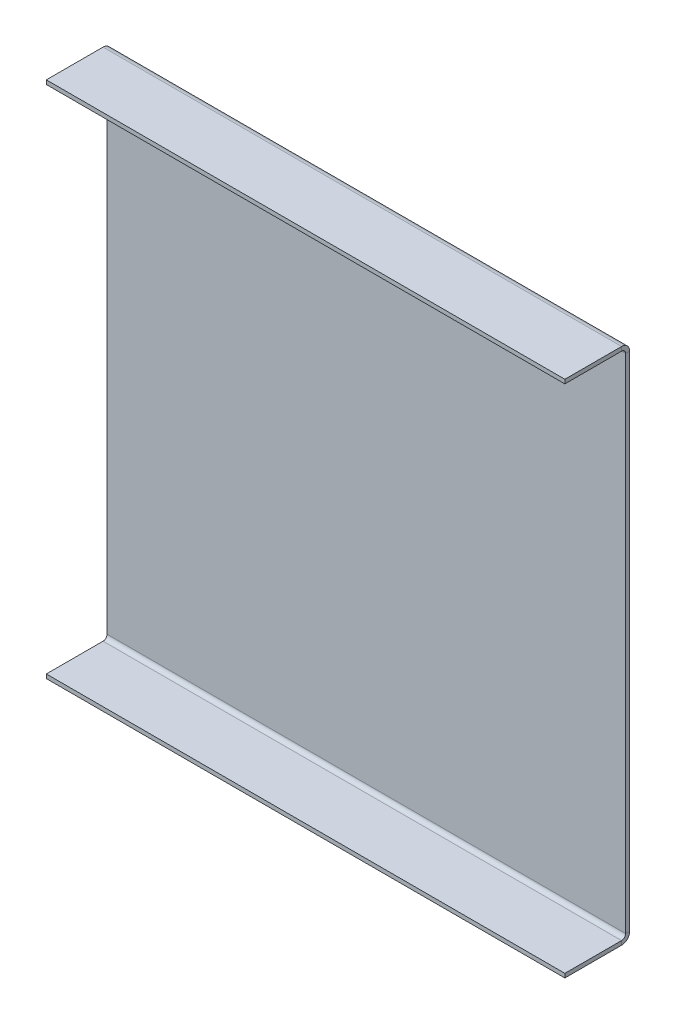
ISO-10303-21;
HEADER;
FILE_DESCRIPTION(('STEP AP214'),'2;1');
FILE_NAME('part.step','',(''),(''),'','','');
FILE_SCHEMA(('AUTOMOTIVE_DESIGN { 1 0 10303 214 1 1 1 1 }'));
ENDSEC;
DATA;
#1=APPLICATION_CONTEXT('core data for automotive mechanical design processes');
#2=APPLICATION_PROTOCOL_DEFINITION('international standard','automotive_design',2000,#1);
#3=PRODUCT_CONTEXT('',#1,'mechanical');
#4=PRODUCT('Part','Part','',(#3));
#5=PRODUCT_RELATED_PRODUCT_CATEGORY('part','',(#4));
#6=PRODUCT_DEFINITION_FORMATION('','',#4);
#7=PRODUCT_DEFINITION_CONTEXT('part definition',#1,'design');
#8=PRODUCT_DEFINITION('design','',#6,#7);
#9=PRODUCT_DEFINITION_SHAPE('','',#8);
#10=(LENGTH_UNIT() NAMED_UNIT(*) SI_UNIT(.MILLI.,.METRE.));
#11=(NAMED_UNIT(*) PLANE_ANGLE_UNIT() SI_UNIT($,.RADIAN.));
#12=(NAMED_UNIT(*) SI_UNIT($,.STERADIAN.) SOLID_ANGLE_UNIT());
#13=UNCERTAINTY_MEASURE_WITH_UNIT(LENGTH_MEASURE(1.E-05),#10,'distance_accuracy_value','');
#14=(GEOMETRIC_REPRESENTATION_CONTEXT(3) GLOBAL_UNCERTAINTY_ASSIGNED_CONTEXT((#13)) GLOBAL_UNIT_ASSIGNED_CONTEXT((#10,
#11,#12)) REPRESENTATION_CONTEXT('',''));
#15=CARTESIAN_POINT('',(0.,0.,0.));
#16=DIRECTION('',(0.,0.,1.));
#17=DIRECTION('',(1.,0.,0.));
#18=AXIS2_PLACEMENT_3D('',#15,#16,#17);
#19=CARTESIAN_POINT('',(0.,0.,0.));
#20=DIRECTION('',(0.,0.,1.));
#21=DIRECTION('',(1.,0.,0.));
#22=AXIS2_PLACEMENT_3D('',#19,#20,#21);
#23=PLANE('',#22);
#24=DIRECTION('',(1.,0.,0.));
#25=VECTOR('',#24,1.);
#26=CARTESIAN_POINT('',(203.2,3.17499999999999,0.));
#27=LINE('',#26,#25);
#28=CARTESIAN_POINT('',(203.2,3.17499999999999,0.));
#29=VERTEX_POINT('',#28);
#30=CARTESIAN_POINT('',(0.,3.17500000000001,0.));
#31=VERTEX_POINT('',#30);
#32=EDGE_CURVE('E215',#29,#31,#27,.F.);
#33=ORIENTED_EDGE('',*,*,#32,.T.);
#34=DIRECTION('',(0.,1.,0.));
#35=VECTOR('',#34,1.);
#36=CARTESIAN_POINT('',(0.,0.,0.));
#37=LINE('',#36,#35);
#38=CARTESIAN_POINT('',(0.,200.025,0.));
#39=VERTEX_POINT('',#38);
#40=EDGE_CURVE('E94',#31,#39,#37,.T.);
#41=ORIENTED_EDGE('',*,*,#40,.T.);
#42=DIRECTION('',(-1.,0.,0.));
#43=VECTOR('',#42,1.);
#44=CARTESIAN_POINT('',(0.,200.025,0.));
#45=LINE('',#44,#43);
#46=CARTESIAN_POINT('',(203.2,200.025,0.));
#47=VERTEX_POINT('',#46);
#48=EDGE_CURVE('E268',#39,#47,#45,.F.);
#49=ORIENTED_EDGE('',*,*,#48,.T.);
#50=DIRECTION('',(0.,1.,0.));
#51=VECTOR('',#50,1.);
#52=CARTESIAN_POINT('',(203.2,0.,0.));
#53=LINE('',#52,#51);
#54=EDGE_CURVE('E13',#29,#47,#53,.T.);
#55=ORIENTED_EDGE('',*,*,#54,.F.);
#56=EDGE_LOOP('',(#33,#41,#49,#55));
#57=FACE_BOUND('',#56,.T.);
#58=ADVANCED_FACE('F85',(#57),#23,.F.);
#59=CARTESIAN_POINT('',(0.,0.,1.5875));
#60=DIRECTION('',(0.,0.,1.));
#61=DIRECTION('',(1.,0.,0.));
#62=AXIS2_PLACEMENT_3D('',#59,#60,#61);
#63=PLANE('',#62);
#64=DIRECTION('',(0.,1.,0.));
#65=VECTOR('',#64,1.);
#66=CARTESIAN_POINT('',(0.,0.,1.5875));
#67=LINE('',#66,#65);
#68=CARTESIAN_POINT('',(0.,3.17499999999999,1.5875));
#69=VERTEX_POINT('',#68);
#70=CARTESIAN_POINT('',(0.,200.025,1.5875));
#71=VERTEX_POINT('',#70);
#72=EDGE_CURVE('E89',#69,#71,#67,.T.);
#73=ORIENTED_EDGE('',*,*,#72,.F.);
#74=DIRECTION('',(1.,0.,0.));
#75=VECTOR('',#74,1.);
#76=CARTESIAN_POINT('',(203.2,3.17499999999999,1.5875));
#77=LINE('',#76,#75);
#78=CARTESIAN_POINT('',(203.2,3.17499999999999,1.5875));
#79=VERTEX_POINT('',#78);
#80=EDGE_CURVE('E227',#79,#69,#77,.F.);
#81=ORIENTED_EDGE('',*,*,#80,.F.);
#82=DIRECTION('',(0.,1.,0.));
#83=VECTOR('',#82,1.);
#84=CARTESIAN_POINT('',(203.2,0.,1.5875));
#85=LINE('',#84,#83);
#86=CARTESIAN_POINT('',(203.2,200.025,1.5875));
#87=VERTEX_POINT('',#86);
#88=EDGE_CURVE('E290',#79,#87,#85,.T.);
#89=ORIENTED_EDGE('',*,*,#88,.T.);
#90=DIRECTION('',(-1.,0.,0.));
#91=VECTOR('',#90,1.);
#92=CARTESIAN_POINT('',(0.,200.025,1.5875));
#93=LINE('',#92,#91);
#94=EDGE_CURVE('E280',#71,#87,#93,.F.);
#95=ORIENTED_EDGE('',*,*,#94,.F.);
#96=EDGE_LOOP('',(#73,#81,#89,#95));
#97=FACE_BOUND('',#96,.T.);
#98=ADVANCED_FACE('F293',(#97),#63,.T.);
#99=CARTESIAN_POINT('',(203.2,0.,0.));
#100=DIRECTION('',(1.,0.,0.));
#101=DIRECTION('',(0.,1.,0.));
#102=AXIS2_PLACEMENT_3D('',#99,#100,#101);
#103=PLANE('',#102);
#104=ORIENTED_EDGE('',*,*,#88,.F.);
#105=DIRECTION('',(0.,0.,-1.));
#106=VECTOR('',#105,1.);
#107=CARTESIAN_POINT('',(203.2,3.17499999999999,1.5875));
#108=LINE('',#107,#106);
#109=EDGE_CURVE('E221',#79,#29,#108,.T.);
#110=ORIENTED_EDGE('',*,*,#109,.T.);
#111=ORIENTED_EDGE('',*,*,#54,.T.);
#112=DIRECTION('',(0.,0.,-1.));
#113=VECTOR('',#112,1.);
#114=CARTESIAN_POINT('',(203.2,200.025,1.5875));
#115=LINE('',#114,#113);
#116=EDGE_CURVE('E285',#87,#47,#115,.T.);
#117=ORIENTED_EDGE('',*,*,#116,.F.);
#118=EDGE_LOOP('',(#104,#110,#111,#117));
#119=FACE_BOUND('',#118,.T.);
#120=ADVANCED_FACE('F296',(#119),#103,.T.);
#121=CARTESIAN_POINT('',(0.,0.,0.));
#122=DIRECTION('',(1.,0.,0.));
#123=DIRECTION('',(0.,1.,0.));
#124=AXIS2_PLACEMENT_3D('',#121,#122,#123);
#125=PLANE('',#124);
#126=DIRECTION('',(0.,0.,-1.));
#127=VECTOR('',#126,1.);
#128=CARTESIAN_POINT('',(0.,3.17499999999999,1.5875));
#129=LINE('',#128,#127);
#130=EDGE_CURVE('E233',#69,#31,#129,.T.);
#131=ORIENTED_EDGE('',*,*,#130,.F.);
#132=ORIENTED_EDGE('',*,*,#72,.T.);
#133=DIRECTION('',(0.,0.,-1.));
#134=VECTOR('',#133,1.);
#135=CARTESIAN_POINT('',(0.,200.025,1.5875));
#136=LINE('',#135,#134);
#137=EDGE_CURVE('E274',#71,#39,#136,.T.);
#138=ORIENTED_EDGE('',*,*,#137,.T.);
#139=ORIENTED_EDGE('',*,*,#40,.F.);
#140=EDGE_LOOP('',(#131,#132,#138,#139));
#141=FACE_BOUND('',#140,.T.);
#142=ADVANCED_FACE('F87',(#141),#125,.F.);
#143=CARTESIAN_POINT('',(203.2,200.025,3.17499999999999));
#144=DIRECTION('',(1.,0.,0.));
#145=DIRECTION('',(0.,0.,-1.));
#146=AXIS2_PLACEMENT_3D('',#143,#144,#145);
#147=PLANE('',#146);
#148=DIRECTION('',(0.,-1.,0.));
#149=VECTOR('',#148,1.);
#150=CARTESIAN_POINT('',(203.2,203.2,3.17499999999998));
#151=LINE('',#150,#149);
#152=CARTESIAN_POINT('',(203.2,201.6125,3.17499999999998));
#153=VERTEX_POINT('',#152);
#154=CARTESIAN_POINT('',(203.2,203.2,3.17499999999998));
#155=VERTEX_POINT('',#154);
#156=EDGE_CURVE('E236',#153,#155,#151,.F.);
#157=ORIENTED_EDGE('',*,*,#156,.F.);
#158=CARTESIAN_POINT('',(203.2,200.025,3.17499999999999));
#159=DIRECTION('',(-1.,0.,0.));
#160=DIRECTION('',(0.,0.,1.));
#161=AXIS2_PLACEMENT_3D('',#158,#159,#160);
#162=CIRCLE('',#161,1.58749999999999);
#163=EDGE_CURVE('E277',#87,#153,#162,.F.);
#164=ORIENTED_EDGE('',*,*,#163,.F.);
#165=ORIENTED_EDGE('',*,*,#116,.T.);
#166=CARTESIAN_POINT('',(203.2,200.025,3.17499999999999));
#167=DIRECTION('',(-1.,0.,0.));
#168=DIRECTION('',(0.,0.,1.));
#169=AXIS2_PLACEMENT_3D('',#166,#167,#168);
#170=CIRCLE('',#169,3.17499999999999);
#171=EDGE_CURVE('E270',#47,#155,#170,.F.);
#172=ORIENTED_EDGE('',*,*,#171,.T.);
#173=EDGE_LOOP('',(#157,#164,#165,#172));
#174=FACE_BOUND('',#173,.T.);
#175=ADVANCED_FACE('F304',(#174),#147,.T.);
#176=CARTESIAN_POINT('',(0.,200.025,3.17499999999999));
#177=DIRECTION('',(1.,0.,0.));
#178=DIRECTION('',(0.,0.,-1.));
#179=AXIS2_PLACEMENT_3D('',#176,#177,#178);
#180=PLANE('',#179);
#181=CARTESIAN_POINT('',(0.,200.025,3.17499999999999));
#182=DIRECTION('',(-1.,0.,0.));
#183=DIRECTION('',(0.,0.,1.));
#184=AXIS2_PLACEMENT_3D('',#181,#182,#183);
#185=CIRCLE('',#184,1.58749999999999);
#186=CARTESIAN_POINT('',(0.,201.6125,3.17499999999998));
#187=VERTEX_POINT('',#186);
#188=EDGE_CURVE('E241',#187,#71,#185,.T.);
#189=ORIENTED_EDGE('',*,*,#188,.F.);
#190=DIRECTION('',(0.,-1.,0.));
#191=VECTOR('',#190,1.);
#192=CARTESIAN_POINT('',(0.,201.6125,3.17499999999998));
#193=LINE('',#192,#191);
#194=CARTESIAN_POINT('',(0.,203.2,3.17499999999998));
#195=VERTEX_POINT('',#194);
#196=EDGE_CURVE('E261',#187,#195,#193,.F.);
#197=ORIENTED_EDGE('',*,*,#196,.T.);
#198=CARTESIAN_POINT('',(0.,200.025,3.17499999999999));
#199=DIRECTION('',(-1.,0.,0.));
#200=DIRECTION('',(0.,0.,1.));
#201=AXIS2_PLACEMENT_3D('',#198,#199,#200);
#202=CIRCLE('',#201,3.17499999999999);
#203=EDGE_CURVE('E271',#195,#39,#202,.T.);
#204=ORIENTED_EDGE('',*,*,#203,.T.);
#205=ORIENTED_EDGE('',*,*,#137,.F.);
#206=EDGE_LOOP('',(#189,#197,#204,#205));
#207=FACE_BOUND('',#206,.T.);
#208=ADVANCED_FACE('F324',(#207),#180,.F.);
#209=CARTESIAN_POINT('',(0.,200.025,3.17499999999999));
#210=DIRECTION('',(-1.,0.,0.));
#211=DIRECTION('',(0.,1.,0.));
#212=AXIS2_PLACEMENT_3D('',#209,#210,#211);
#213=CYLINDRICAL_SURFACE('',#212,3.17499999999999);
#214=ORIENTED_EDGE('',*,*,#48,.F.);
#215=ORIENTED_EDGE('',*,*,#203,.F.);
#216=DIRECTION('',(-1.,0.,0.));
#217=VECTOR('',#216,1.);
#218=CARTESIAN_POINT('',(203.2,203.2,3.17499999999998));
#219=LINE('',#218,#217);
#220=EDGE_CURVE('E259',#195,#155,#219,.F.);
#221=ORIENTED_EDGE('',*,*,#220,.T.);
#222=ORIENTED_EDGE('',*,*,#171,.F.);
#223=EDGE_LOOP('',(#214,#215,#221,#222));
#224=FACE_BOUND('',#223,.T.);
#225=ADVANCED_FACE('F334',(#224),#213,.T.);
#226=CARTESIAN_POINT('',(0.,200.025,3.17499999999999));
#227=DIRECTION('',(-1.,0.,0.));
#228=DIRECTION('',(0.,1.,0.));
#229=AXIS2_PLACEMENT_3D('',#226,#227,#228);
#230=CYLINDRICAL_SURFACE('',#229,1.58749999999999);
#231=ORIENTED_EDGE('',*,*,#94,.T.);
#232=ORIENTED_EDGE('',*,*,#163,.T.);
#233=DIRECTION('',(-1.,0.,0.));
#234=VECTOR('',#233,1.);
#235=CARTESIAN_POINT('',(203.2,201.6125,3.17499999999998));
#236=LINE('',#235,#234);
#237=EDGE_CURVE('E264',#153,#187,#236,.T.);
#238=ORIENTED_EDGE('',*,*,#237,.T.);
#239=ORIENTED_EDGE('',*,*,#188,.T.);
#240=EDGE_LOOP('',(#231,#232,#238,#239));
#241=FACE_BOUND('',#240,.T.);
#242=ADVANCED_FACE('F301',(#241),#230,.F.);
#243=CARTESIAN_POINT('',(0.,203.2,25.4));
#244=DIRECTION('',(1.,0.,0.));
#245=DIRECTION('',(0.,0.,-1.));
#246=AXIS2_PLACEMENT_3D('',#243,#244,#245);
#247=PLANE('',#246);
#248=ORIENTED_EDGE('',*,*,#196,.F.);
#249=DIRECTION('',(0.,0.,-1.));
#250=VECTOR('',#249,1.);
#251=CARTESIAN_POINT('',(0.,201.6125,25.4));
#252=LINE('',#251,#250);
#253=CARTESIAN_POINT('',(0.,201.6125,25.4));
#254=VERTEX_POINT('',#253);
#255=EDGE_CURVE('E257',#187,#254,#252,.F.);
#256=ORIENTED_EDGE('',*,*,#255,.T.);
#257=DIRECTION('',(0.,-1.,0.));
#258=VECTOR('',#257,1.);
#259=CARTESIAN_POINT('',(0.,203.2,25.4));
#260=LINE('',#259,#258);
#261=CARTESIAN_POINT('',(0.,203.2,25.4));
#262=VERTEX_POINT('',#261);
#263=EDGE_CURVE('E238',#262,#254,#260,.T.);
#264=ORIENTED_EDGE('',*,*,#263,.F.);
#265=DIRECTION('',(0.,0.,1.));
#266=VECTOR('',#265,1.);
#267=CARTESIAN_POINT('',(0.,203.2,-7.16085462385513E-13));
#268=LINE('',#267,#266);
#269=EDGE_CURVE('E250',#195,#262,#268,.T.);
#270=ORIENTED_EDGE('',*,*,#269,.F.);
#271=EDGE_LOOP('',(#248,#256,#264,#270));
#272=FACE_BOUND('',#271,.T.);
#273=ADVANCED_FACE('F326',(#272),#247,.F.);
#274=CARTESIAN_POINT('',(203.2,203.2,1.58749999999999));
#275=DIRECTION('',(-1.,0.,0.));
#276=DIRECTION('',(0.,0.,1.));
#277=AXIS2_PLACEMENT_3D('',#274,#275,#276);
#278=PLANE('',#277);
#279=ORIENTED_EDGE('',*,*,#156,.T.);
#280=DIRECTION('',(0.,0.,-1.));
#281=VECTOR('',#280,1.);
#282=CARTESIAN_POINT('',(203.2,203.2,-7.16085462385513E-13));
#283=LINE('',#282,#281);
#284=CARTESIAN_POINT('',(203.2,203.2,25.4));
#285=VERTEX_POINT('',#284);
#286=EDGE_CURVE('E245',#285,#155,#283,.T.);
#287=ORIENTED_EDGE('',*,*,#286,.F.);
#288=DIRECTION('',(0.,-1.,0.));
#289=VECTOR('',#288,1.);
#290=CARTESIAN_POINT('',(203.2,203.2,25.4));
#291=LINE('',#290,#289);
#292=CARTESIAN_POINT('',(203.2,201.6125,25.4));
#293=VERTEX_POINT('',#292);
#294=EDGE_CURVE('E242',#285,#293,#291,.T.);
#295=ORIENTED_EDGE('',*,*,#294,.T.);
#296=DIRECTION('',(0.,0.,1.));
#297=VECTOR('',#296,1.);
#298=CARTESIAN_POINT('',(203.2,201.6125,1.5875));
#299=LINE('',#298,#297);
#300=EDGE_CURVE('E252',#293,#153,#299,.F.);
#301=ORIENTED_EDGE('',*,*,#300,.T.);
#302=EDGE_LOOP('',(#279,#287,#295,#301));
#303=FACE_BOUND('',#302,.T.);
#304=ADVANCED_FACE('F307',(#303),#278,.F.);
#305=CARTESIAN_POINT('',(0.,203.2,-7.16085462385513E-13));
#306=DIRECTION('',(0.,-1.,0.));
#307=DIRECTION('',(0.,0.,-1.));
#308=AXIS2_PLACEMENT_3D('',#305,#306,#307);
#309=PLANE('',#308);
#310=ORIENTED_EDGE('',*,*,#220,.F.);
#311=ORIENTED_EDGE('',*,*,#269,.T.);
#312=DIRECTION('',(1.,0.,0.));
#313=VECTOR('',#312,1.);
#314=CARTESIAN_POINT('',(0.,203.2,25.4));
#315=LINE('',#314,#313);
#316=EDGE_CURVE('E248',#262,#285,#315,.T.);
#317=ORIENTED_EDGE('',*,*,#316,.T.);
#318=ORIENTED_EDGE('',*,*,#286,.T.);
#319=EDGE_LOOP('',(#310,#311,#317,#318));
#320=FACE_BOUND('',#319,.T.);
#321=ADVANCED_FACE('F311',(#320),#309,.F.);
#322=CARTESIAN_POINT('',(0.,201.6125,-7.105427357601E-13));
#323=DIRECTION('',(0.,-1.,0.));
#324=DIRECTION('',(0.,0.,-1.));
#325=AXIS2_PLACEMENT_3D('',#322,#323,#324);
#326=PLANE('',#325);
#327=ORIENTED_EDGE('',*,*,#255,.F.);
#328=ORIENTED_EDGE('',*,*,#237,.F.);
#329=ORIENTED_EDGE('',*,*,#300,.F.);
#330=DIRECTION('',(-1.,0.,0.));
#331=VECTOR('',#330,1.);
#332=CARTESIAN_POINT('',(203.2,201.6125,25.4));
#333=LINE('',#332,#331);
#334=EDGE_CURVE('E255',#254,#293,#333,.F.);
#335=ORIENTED_EDGE('',*,*,#334,.F.);
#336=EDGE_LOOP('',(#327,#328,#329,#335));
#337=FACE_BOUND('',#336,.T.);
#338=ADVANCED_FACE('F321',(#337),#326,.T.);
#339=CARTESIAN_POINT('',(203.2,203.2,25.4));
#340=DIRECTION('',(0.,0.,-1.));
#341=DIRECTION('',(0.,1.,0.));
#342=AXIS2_PLACEMENT_3D('',#339,#340,#341);
#343=PLANE('',#342);
#344=ORIENTED_EDGE('',*,*,#334,.T.);
#345=ORIENTED_EDGE('',*,*,#294,.F.);
#346=ORIENTED_EDGE('',*,*,#316,.F.);
#347=ORIENTED_EDGE('',*,*,#263,.T.);
#348=EDGE_LOOP('',(#344,#345,#346,#347));
#349=FACE_BOUND('',#348,.T.);
#350=ADVANCED_FACE('F317',(#349),#343,.F.);
#351=CARTESIAN_POINT('',(0.,3.17499999999999,3.175));
#352=DIRECTION('',(-1.,0.,0.));
#353=DIRECTION('',(0.,0.,1.));
#354=AXIS2_PLACEMENT_3D('',#351,#352,#353);
#355=PLANE('',#354);
#356=DIRECTION('',(0.,1.,0.));
#357=VECTOR('',#356,1.);
#358=CARTESIAN_POINT('',(0.,0.,3.17499999999999));
#359=LINE('',#358,#357);
#360=CARTESIAN_POINT('',(0.,1.58749999999999,3.17499999999999));
#361=VERTEX_POINT('',#360);
#362=CARTESIAN_POINT('',(1.11022302462516E-13,0.,3.17499999999999));
#363=VERTEX_POINT('',#362);
#364=EDGE_CURVE('E198',#361,#363,#359,.F.);
#365=ORIENTED_EDGE('',*,*,#364,.F.);
#366=CARTESIAN_POINT('',(0.,3.17499999999999,3.175));
#367=DIRECTION('',(1.,0.,0.));
#368=DIRECTION('',(0.,0.,-1.));
#369=AXIS2_PLACEMENT_3D('',#366,#367,#368);
#370=CIRCLE('',#369,1.5875);
#371=EDGE_CURVE('E224',#69,#361,#370,.F.);
#372=ORIENTED_EDGE('',*,*,#371,.F.);
#373=ORIENTED_EDGE('',*,*,#130,.T.);
#374=CARTESIAN_POINT('',(1.11022302462516E-13,3.17499999999999,3.175));
#375=DIRECTION('',(1.,0.,0.));
#376=DIRECTION('',(0.,0.,-1.));
#377=AXIS2_PLACEMENT_3D('',#374,#375,#376);
#378=CIRCLE('',#377,3.175);
#379=EDGE_CURVE('E217',#31,#363,#378,.F.);
#380=ORIENTED_EDGE('',*,*,#379,.T.);
#381=EDGE_LOOP('',(#365,#372,#373,#380));
#382=FACE_BOUND('',#381,.T.);
#383=ADVANCED_FACE('F362',(#382),#355,.T.);
#384=CARTESIAN_POINT('',(203.2,3.17499999999999,3.175));
#385=DIRECTION('',(-1.,0.,0.));
#386=DIRECTION('',(0.,0.,1.));
#387=AXIS2_PLACEMENT_3D('',#384,#385,#386);
#388=PLANE('',#387);
#389=CARTESIAN_POINT('',(203.2,3.17499999999999,3.175));
#390=DIRECTION('',(1.,0.,0.));
#391=DIRECTION('',(0.,0.,-1.));
#392=AXIS2_PLACEMENT_3D('',#389,#390,#391);
#393=CIRCLE('',#392,1.5875);
#394=CARTESIAN_POINT('',(203.2,1.58749999999999,3.17499999999999));
#395=VERTEX_POINT('',#394);
#396=EDGE_CURVE('E230',#395,#79,#393,.T.);
#397=ORIENTED_EDGE('',*,*,#396,.F.);
#398=DIRECTION('',(0.,1.,0.));
#399=VECTOR('',#398,1.);
#400=CARTESIAN_POINT('',(203.2,1.58749999999999,3.17499999999999));
#401=LINE('',#400,#399);
#402=CARTESIAN_POINT('',(203.2,0.,3.17499999999999));
#403=VERTEX_POINT('',#402);
#404=EDGE_CURVE('E209',#395,#403,#401,.F.);
#405=ORIENTED_EDGE('',*,*,#404,.T.);
#406=CARTESIAN_POINT('',(203.2,3.17499999999999,3.175));
#407=DIRECTION('',(1.,0.,0.));
#408=DIRECTION('',(0.,0.,-1.));
#409=AXIS2_PLACEMENT_3D('',#406,#407,#408);
#410=CIRCLE('',#409,3.175);
#411=EDGE_CURVE('E218',#403,#29,#410,.T.);
#412=ORIENTED_EDGE('',*,*,#411,.T.);
#413=ORIENTED_EDGE('',*,*,#109,.F.);
#414=EDGE_LOOP('',(#397,#405,#412,#413));
#415=FACE_BOUND('',#414,.T.);
#416=ADVANCED_FACE('F374',(#415),#388,.F.);
#417=CARTESIAN_POINT('',(203.2,3.17499999999999,3.175));
#418=DIRECTION('',(1.,0.,0.));
#419=DIRECTION('',(0.,-1.,0.));
#420=AXIS2_PLACEMENT_3D('',#417,#418,#419);
#421=CYLINDRICAL_SURFACE('',#420,3.175);
#422=ORIENTED_EDGE('',*,*,#32,.F.);
#423=ORIENTED_EDGE('',*,*,#411,.F.);
#424=DIRECTION('',(1.,0.,0.));
#425=VECTOR('',#424,1.);
#426=CARTESIAN_POINT('',(0.,0.,3.17499999999999));
#427=LINE('',#426,#425);
#428=EDGE_CURVE('E207',#403,#363,#427,.F.);
#429=ORIENTED_EDGE('',*,*,#428,.T.);
#430=ORIENTED_EDGE('',*,*,#379,.F.);
#431=EDGE_LOOP('',(#422,#423,#429,#430));
#432=FACE_BOUND('',#431,.T.);
#433=ADVANCED_FACE('F365',(#432),#421,.T.);
#434=CARTESIAN_POINT('',(203.2,3.17499999999999,3.175));
#435=DIRECTION('',(1.,0.,0.));
#436=DIRECTION('',(0.,-1.,0.));
#437=AXIS2_PLACEMENT_3D('',#434,#435,#436);
#438=CYLINDRICAL_SURFACE('',#437,1.5875);
#439=ORIENTED_EDGE('',*,*,#80,.T.);
#440=ORIENTED_EDGE('',*,*,#371,.T.);
#441=DIRECTION('',(1.,0.,0.));
#442=VECTOR('',#441,1.);
#443=CARTESIAN_POINT('',(0.,1.58749999999999,3.17499999999999));
#444=LINE('',#443,#442);
#445=EDGE_CURVE('E212',#361,#395,#444,.T.);
#446=ORIENTED_EDGE('',*,*,#445,.T.);
#447=ORIENTED_EDGE('',*,*,#396,.T.);
#448=EDGE_LOOP('',(#439,#440,#446,#447));
#449=FACE_BOUND('',#448,.T.);
#450=ADVANCED_FACE('F359',(#449),#438,.F.);
#451=CARTESIAN_POINT('',(0.,0.,1.58749999999999));
#452=DIRECTION('',(1.,0.,0.));
#453=DIRECTION('',(0.,0.,-1.));
#454=AXIS2_PLACEMENT_3D('',#451,#452,#453);
#455=PLANE('',#454);
#456=ORIENTED_EDGE('',*,*,#364,.T.);
#457=DIRECTION('',(0.,0.,-1.));
#458=VECTOR('',#457,1.);
#459=CARTESIAN_POINT('',(0.,0.,0.));
#460=LINE('',#459,#458);
#461=CARTESIAN_POINT('',(0.,0.,25.4));
#462=VERTEX_POINT('',#461);
#463=EDGE_CURVE('E179',#462,#363,#460,.T.);
#464=ORIENTED_EDGE('',*,*,#463,.F.);
#465=DIRECTION('',(0.,1.,0.));
#466=VECTOR('',#465,1.);
#467=CARTESIAN_POINT('',(0.,0.,25.4));
#468=LINE('',#467,#466);
#469=CARTESIAN_POINT('',(0.,1.58749999999992,25.4));
#470=VERTEX_POINT('',#469);
#471=EDGE_CURVE('E185',#462,#470,#468,.T.);
#472=ORIENTED_EDGE('',*,*,#471,.T.);
#473=DIRECTION('',(0.,0.,1.));
#474=VECTOR('',#473,1.);
#475=CARTESIAN_POINT('',(0.,1.5875,1.5875));
#476=LINE('',#475,#474);
#477=EDGE_CURVE('E205',#470,#361,#476,.F.);
#478=ORIENTED_EDGE('',*,*,#477,.T.);
#479=EDGE_LOOP('',(#456,#464,#472,#478));
#480=FACE_BOUND('',#479,.T.);
#481=ADVANCED_FACE('F197',(#480),#455,.F.);
#482=CARTESIAN_POINT('',(203.2,0.,25.4));
#483=DIRECTION('',(-1.,0.,0.));
#484=DIRECTION('',(0.,0.,1.));
#485=AXIS2_PLACEMENT_3D('',#482,#483,#484);
#486=PLANE('',#485);
#487=ORIENTED_EDGE('',*,*,#404,.F.);
#488=DIRECTION('',(0.,0.,-1.));
#489=VECTOR('',#488,1.);
#490=CARTESIAN_POINT('',(203.2,1.58749999999992,25.4));
#491=LINE('',#490,#489);
#492=CARTESIAN_POINT('',(203.2,1.58749999999992,25.4));
#493=VERTEX_POINT('',#492);
#494=EDGE_CURVE('E201',#395,#493,#491,.F.);
#495=ORIENTED_EDGE('',*,*,#494,.T.);
#496=DIRECTION('',(0.,1.,0.));
#497=VECTOR('',#496,1.);
#498=CARTESIAN_POINT('',(203.2,0.,25.4));
#499=LINE('',#498,#497);
#500=CARTESIAN_POINT('',(203.2,0.,25.4));
#501=VERTEX_POINT('',#500);
#502=EDGE_CURVE('E194',#501,#493,#499,.T.);
#503=ORIENTED_EDGE('',*,*,#502,.F.);
#504=DIRECTION('',(0.,0.,1.));
#505=VECTOR('',#504,1.);
#506=CARTESIAN_POINT('',(203.2,0.,0.));
#507=LINE('',#506,#505);
#508=EDGE_CURVE('E181',#403,#501,#507,.T.);
#509=ORIENTED_EDGE('',*,*,#508,.F.);
#510=EDGE_LOOP('',(#487,#495,#503,#509));
#511=FACE_BOUND('',#510,.T.);
#512=ADVANCED_FACE('F368',(#511),#486,.F.);
#513=CARTESIAN_POINT('',(0.,0.,0.));
#514=DIRECTION('',(0.,1.,0.));
#515=DIRECTION('',(0.,0.,1.));
#516=AXIS2_PLACEMENT_3D('',#513,#514,#515);
#517=PLANE('',#516);
#518=ORIENTED_EDGE('',*,*,#428,.F.);
#519=ORIENTED_EDGE('',*,*,#508,.T.);
#520=DIRECTION('',(-1.,0.,0.));
#521=VECTOR('',#520,1.);
#522=CARTESIAN_POINT('',(0.,0.,25.4));
#523=LINE('',#522,#521);
#524=EDGE_CURVE('E174',#501,#462,#523,.T.);
#525=ORIENTED_EDGE('',*,*,#524,.T.);
#526=ORIENTED_EDGE('',*,*,#463,.T.);
#527=EDGE_LOOP('',(#518,#519,#525,#526));
#528=FACE_BOUND('',#527,.T.);
#529=ADVANCED_FACE('F177',(#528),#517,.F.);
#530=CARTESIAN_POINT('',(0.,1.58750000000001,0.));
#531=DIRECTION('',(0.,1.,0.));
#532=DIRECTION('',(0.,0.,1.));
#533=AXIS2_PLACEMENT_3D('',#530,#531,#532);
#534=PLANE('',#533);
#535=ORIENTED_EDGE('',*,*,#494,.F.);
#536=ORIENTED_EDGE('',*,*,#445,.F.);
#537=ORIENTED_EDGE('',*,*,#477,.F.);
#538=DIRECTION('',(1.,0.,0.));
#539=VECTOR('',#538,1.);
#540=CARTESIAN_POINT('',(0.,1.58749999999992,25.4));
#541=LINE('',#540,#539);
#542=EDGE_CURVE('E190',#493,#470,#541,.F.);
#543=ORIENTED_EDGE('',*,*,#542,.F.);
#544=EDGE_LOOP('',(#535,#536,#537,#543));
#545=FACE_BOUND('',#544,.T.);
#546=ADVANCED_FACE('F372',(#545),#534,.T.);
#547=CARTESIAN_POINT('',(0.,0.,25.4));
#548=DIRECTION('',(0.,0.,-1.));
#549=DIRECTION('',(0.,1.,0.));
#550=AXIS2_PLACEMENT_3D('',#547,#548,#549);
#551=PLANE('',#550);
#552=ORIENTED_EDGE('',*,*,#542,.T.);
#553=ORIENTED_EDGE('',*,*,#471,.F.);
#554=ORIENTED_EDGE('',*,*,#524,.F.);
#555=ORIENTED_EDGE('',*,*,#502,.T.);
#556=EDGE_LOOP('',(#552,#553,#554,#555));
#557=FACE_BOUND('',#556,.T.);
#558=ADVANCED_FACE('F188',(#557),#551,.F.);
#559=CLOSED_SHELL('',(#58,#98,#120,#142,#175,#208,#225,#242,#273,#304,#321,#338,#350,#383,#416,
#433,#450,#481,#512,#529,#546,#558));
#560=MANIFOLD_SOLID_BREP('B2',#559);
#561=ADVANCED_BREP_SHAPE_REPRESENTATION('',(#18,#560),#14);
#562=SHAPE_DEFINITION_REPRESENTATION(#9,#561);
ENDSEC;
END-ISO-10303-21;
